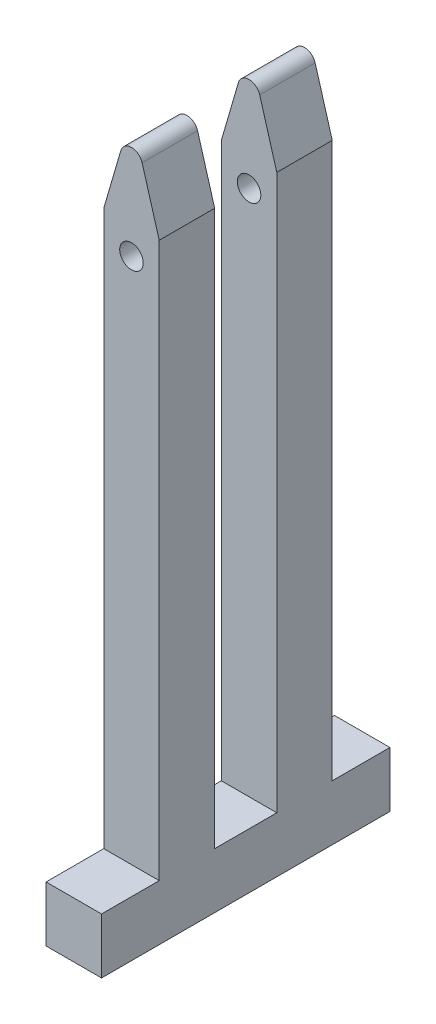
ISO-10303-21;
HEADER;
FILE_DESCRIPTION(('STEP AP214'),'2;1');
FILE_NAME('part.step','',(''),(''),'','','');
FILE_SCHEMA(('AUTOMOTIVE_DESIGN { 1 0 10303 214 1 1 1 1 }'));
ENDSEC;
DATA;
#1=APPLICATION_CONTEXT('core data for automotive mechanical design processes');
#2=APPLICATION_PROTOCOL_DEFINITION('international standard','automotive_design',2000,#1);
#3=PRODUCT_CONTEXT('',#1,'mechanical');
#4=PRODUCT('Part','Part','',(#3));
#5=PRODUCT_RELATED_PRODUCT_CATEGORY('part','',(#4));
#6=PRODUCT_DEFINITION_FORMATION('','',#4);
#7=PRODUCT_DEFINITION_CONTEXT('part definition',#1,'design');
#8=PRODUCT_DEFINITION('design','',#6,#7);
#9=PRODUCT_DEFINITION_SHAPE('','',#8);
#10=(LENGTH_UNIT() NAMED_UNIT(*) SI_UNIT(.MILLI.,.METRE.));
#11=(NAMED_UNIT(*) PLANE_ANGLE_UNIT() SI_UNIT($,.RADIAN.));
#12=(NAMED_UNIT(*) SI_UNIT($,.STERADIAN.) SOLID_ANGLE_UNIT());
#13=UNCERTAINTY_MEASURE_WITH_UNIT(LENGTH_MEASURE(1.E-05),#10,'distance_accuracy_value','');
#14=(GEOMETRIC_REPRESENTATION_CONTEXT(3) GLOBAL_UNCERTAINTY_ASSIGNED_CONTEXT((#13)) GLOBAL_UNIT_ASSIGNED_CONTEXT((#10,
#11,#12)) REPRESENTATION_CONTEXT('',''));
#15=CARTESIAN_POINT('',(0.,0.,0.));
#16=DIRECTION('',(0.,0.,1.));
#17=DIRECTION('',(1.,0.,0.));
#18=AXIS2_PLACEMENT_3D('',#15,#16,#17);
#19=CARTESIAN_POINT('',(0.,275.,-78.0512483795333));
#20=DIRECTION('',(0.,0.,1.));
#21=DIRECTION('',(1.,0.,0.));
#22=AXIS2_PLACEMENT_3D('',#19,#20,#21);
#23=CYLINDRICAL_SURFACE('',#22,5.);
#24=DIRECTION('',(0.,0.,1.));
#25=VECTOR('',#24,1.);
#26=CARTESIAN_POINT('',(4.8,276.4,-78.0512483795333));
#27=LINE('',#26,#25);
#28=CARTESIAN_POINT('',(4.80000000000001,276.4,14.));
#29=VERTEX_POINT('',#28);
#30=CARTESIAN_POINT('',(4.8,276.4,39.));
#31=VERTEX_POINT('',#30);
#32=EDGE_CURVE('E315',#29,#31,#27,.T.);
#33=ORIENTED_EDGE('',*,*,#32,.F.);
#34=CARTESIAN_POINT('',(0.,275.,14.));
#35=DIRECTION('',(0.,0.,-1.));
#36=DIRECTION('',(-1.,0.,0.));
#37=AXIS2_PLACEMENT_3D('',#34,#35,#36);
#38=CIRCLE('',#37,5.);
#39=CARTESIAN_POINT('',(-4.80000000000001,276.4,14.));
#40=VERTEX_POINT('',#39);
#41=EDGE_CURVE('E161',#29,#40,#38,.F.);
#42=ORIENTED_EDGE('',*,*,#41,.T.);
#43=DIRECTION('',(0.,0.,1.));
#44=VECTOR('',#43,1.);
#45=CARTESIAN_POINT('',(-4.8,276.4,-78.0512483795333));
#46=LINE('',#45,#44);
#47=CARTESIAN_POINT('',(-4.8,276.4,39.));
#48=VERTEX_POINT('',#47);
#49=EDGE_CURVE('E201',#40,#48,#46,.T.);
#50=ORIENTED_EDGE('',*,*,#49,.T.);
#51=CARTESIAN_POINT('',(0.,275.,39.));
#52=DIRECTION('',(0.,0.,1.));
#53=DIRECTION('',(1.,0.,0.));
#54=AXIS2_PLACEMENT_3D('',#51,#52,#53);
#55=CIRCLE('',#54,5.);
#56=EDGE_CURVE('E192',#48,#31,#55,.F.);
#57=ORIENTED_EDGE('',*,*,#56,.T.);
#58=EDGE_LOOP('',(#33,#42,#50,#57));
#59=FACE_BOUND('',#58,.T.);
#60=ADVANCED_FACE('F45',(#59),#23,.T.);
#61=DIRECTION('',(0.,0.,1.));
#62=VECTOR('',#61,1.);
#63=CARTESIAN_POINT('',(-4.8,276.4,-78.0512483795333));
#64=LINE('',#63,#62);
#65=CARTESIAN_POINT('',(-4.8,276.4,-39.));
#66=VERTEX_POINT('',#65);
#67=CARTESIAN_POINT('',(-4.8,276.4,-14.));
#68=VERTEX_POINT('',#67);
#69=EDGE_CURVE('E160',#66,#68,#64,.T.);
#70=ORIENTED_EDGE('',*,*,#69,.T.);
#71=CARTESIAN_POINT('',(0.,275.,-14.));
#72=DIRECTION('',(0.,0.,1.));
#73=DIRECTION('',(1.,0.,0.));
#74=AXIS2_PLACEMENT_3D('',#71,#72,#73);
#75=CIRCLE('',#74,5.);
#76=CARTESIAN_POINT('',(4.80000000000001,276.4,-14.));
#77=VERTEX_POINT('',#76);
#78=EDGE_CURVE('E62',#68,#77,#75,.F.);
#79=ORIENTED_EDGE('',*,*,#78,.T.);
#80=DIRECTION('',(0.,0.,1.));
#81=VECTOR('',#80,1.);
#82=CARTESIAN_POINT('',(4.8,276.4,-78.0512483795333));
#83=LINE('',#82,#81);
#84=CARTESIAN_POINT('',(4.8,276.4,-39.));
#85=VERTEX_POINT('',#84);
#86=EDGE_CURVE('E49',#85,#77,#83,.T.);
#87=ORIENTED_EDGE('',*,*,#86,.F.);
#88=CARTESIAN_POINT('',(0.,275.,-39.));
#89=DIRECTION('',(0.,0.,1.));
#90=DIRECTION('',(1.,0.,0.));
#91=AXIS2_PLACEMENT_3D('',#88,#89,#90);
#92=CIRCLE('',#91,5.);
#93=EDGE_CURVE('E189',#66,#85,#92,.F.);
#94=ORIENTED_EDGE('',*,*,#93,.F.);
#95=EDGE_LOOP('',(#70,#79,#87,#94));
#96=FACE_BOUND('',#95,.T.);
#97=ADVANCED_FACE('F155',(#96),#23,.T.);
#98=CARTESIAN_POINT('',(12.5,250.,-39.));
#99=DIRECTION('',(-1.,0.,0.));
#100=DIRECTION('',(0.,0.,1.));
#101=AXIS2_PLACEMENT_3D('',#98,#99,#100);
#102=PLANE('',#101);
#103=DIRECTION('',(0.,-1.,0.));
#104=VECTOR('',#103,1.);
#105=CARTESIAN_POINT('',(12.5,250.,-14.));
#106=LINE('',#105,#104);
#107=CARTESIAN_POINT('',(12.5,250.,-14.));
#108=VERTEX_POINT('',#107);
#109=CARTESIAN_POINT('',(12.5,0.,-14.));
#110=VERTEX_POINT('',#109);
#111=EDGE_CURVE('E167',#108,#110,#106,.T.);
#112=ORIENTED_EDGE('',*,*,#111,.T.);
#113=DIRECTION('',(0.,0.,1.));
#114=VECTOR('',#113,1.);
#115=CARTESIAN_POINT('',(12.5,0.,-65.));
#116=LINE('',#115,#114);
#117=CARTESIAN_POINT('',(12.5,0.,14.));
#118=VERTEX_POINT('',#117);
#119=EDGE_CURVE('E237',#110,#118,#116,.T.);
#120=ORIENTED_EDGE('',*,*,#119,.T.);
#121=DIRECTION('',(0.,-1.,0.));
#122=VECTOR('',#121,1.);
#123=CARTESIAN_POINT('',(12.5,250.,14.));
#124=LINE('',#123,#122);
#125=CARTESIAN_POINT('',(12.5,250.,14.));
#126=VERTEX_POINT('',#125);
#127=EDGE_CURVE('E290',#126,#118,#124,.T.);
#128=ORIENTED_EDGE('',*,*,#127,.F.);
#129=DIRECTION('',(0.,0.,-1.));
#130=VECTOR('',#129,1.);
#131=CARTESIAN_POINT('',(12.5,250.,39.));
#132=LINE('',#131,#130);
#133=CARTESIAN_POINT('',(12.5,250.,39.));
#134=VERTEX_POINT('',#133);
#135=EDGE_CURVE('E295',#134,#126,#132,.T.);
#136=ORIENTED_EDGE('',*,*,#135,.F.);
#137=DIRECTION('',(0.,-1.,0.));
#138=VECTOR('',#137,1.);
#139=CARTESIAN_POINT('',(12.5,250.,39.));
#140=LINE('',#139,#138);
#141=CARTESIAN_POINT('',(12.5,0.,39.));
#142=VERTEX_POINT('',#141);
#143=EDGE_CURVE('E288',#134,#142,#140,.T.);
#144=ORIENTED_EDGE('',*,*,#143,.T.);
#145=CARTESIAN_POINT('',(12.5,0.,65.));
#146=VERTEX_POINT('',#145);
#147=EDGE_CURVE('E247',#142,#146,#116,.T.);
#148=ORIENTED_EDGE('',*,*,#147,.T.);
#149=DIRECTION('',(0.,1.,0.));
#150=VECTOR('',#149,1.);
#151=CARTESIAN_POINT('',(12.5,-25.,65.));
#152=LINE('',#151,#150);
#153=CARTESIAN_POINT('',(12.5,-25.,65.));
#154=VERTEX_POINT('',#153);
#155=EDGE_CURVE('E275',#154,#146,#152,.T.);
#156=ORIENTED_EDGE('',*,*,#155,.F.);
#157=DIRECTION('',(0.,0.,1.));
#158=VECTOR('',#157,1.);
#159=CARTESIAN_POINT('',(12.5,-25.,-65.));
#160=LINE('',#159,#158);
#161=CARTESIAN_POINT('',(12.5,-25.,-65.));
#162=VERTEX_POINT('',#161);
#163=EDGE_CURVE('E256',#162,#154,#160,.T.);
#164=ORIENTED_EDGE('',*,*,#163,.F.);
#165=DIRECTION('',(0.,1.,0.));
#166=VECTOR('',#165,1.);
#167=CARTESIAN_POINT('',(12.5,-25.,-65.));
#168=LINE('',#167,#166);
#169=CARTESIAN_POINT('',(12.5,0.,-65.));
#170=VERTEX_POINT('',#169);
#171=EDGE_CURVE('E243',#162,#170,#168,.T.);
#172=ORIENTED_EDGE('',*,*,#171,.T.);
#173=CARTESIAN_POINT('',(12.5,0.,-39.));
#174=VERTEX_POINT('',#173);
#175=EDGE_CURVE('E240',#170,#174,#116,.T.);
#176=ORIENTED_EDGE('',*,*,#175,.T.);
#177=DIRECTION('',(0.,-1.,0.));
#178=VECTOR('',#177,1.);
#179=CARTESIAN_POINT('',(12.5,250.,-39.));
#180=LINE('',#179,#178);
#181=CARTESIAN_POINT('',(12.5,250.,-39.));
#182=VERTEX_POINT('',#181);
#183=EDGE_CURVE('E188',#182,#174,#180,.T.);
#184=ORIENTED_EDGE('',*,*,#183,.F.);
#185=DIRECTION('',(0.,0.,-1.));
#186=VECTOR('',#185,1.);
#187=CARTESIAN_POINT('',(12.5,250.,-39.));
#188=LINE('',#187,#186);
#189=EDGE_CURVE('E174',#108,#182,#188,.T.);
#190=ORIENTED_EDGE('',*,*,#189,.F.);
#191=EDGE_LOOP('',(#112,#120,#128,#136,#144,#148,#156,#164,#172,#176,#184,#190));
#192=FACE_BOUND('',#191,.T.);
#193=ADVANCED_FACE('F235',(#192),#102,.F.);
#194=CARTESIAN_POINT('',(-12.5,250.,-39.));
#195=DIRECTION('',(0.,0.,1.));
#196=DIRECTION('',(1.,0.,0.));
#197=AXIS2_PLACEMENT_3D('',#194,#195,#196);
#198=PLANE('',#197);
#199=CARTESIAN_POINT('',(0.,237.5,-39.));
#200=DIRECTION('',(0.,0.,1.));
#201=DIRECTION('',(1.,0.,0.));
#202=AXIS2_PLACEMENT_3D('',#199,#200,#201);
#203=CIRCLE('',#202,5.3);
#204=CARTESIAN_POINT('',(5.29999999999999,237.5,-39.));
#205=VERTEX_POINT('',#204);
#206=EDGE_CURVE('E183',#205,#205,#203,.T.);
#207=ORIENTED_EDGE('',*,*,#206,.T.);
#208=EDGE_LOOP('',(#207));
#209=FACE_BOUND('',#208,.T.);
#210=DIRECTION('',(0.28,0.96,0.));
#211=VECTOR('',#210,1.);
#212=CARTESIAN_POINT('',(-12.5,250.,-39.));
#213=LINE('',#212,#211);
#214=CARTESIAN_POINT('',(-12.5,250.,-39.));
#215=VERTEX_POINT('',#214);
#216=EDGE_CURVE('E190',#215,#66,#213,.T.);
#217=ORIENTED_EDGE('',*,*,#216,.T.);
#218=ORIENTED_EDGE('',*,*,#93,.T.);
#219=DIRECTION('',(0.279999999999999,-0.96,0.));
#220=VECTOR('',#219,1.);
#221=CARTESIAN_POINT('',(4.8,276.4,-39.));
#222=LINE('',#221,#220);
#223=EDGE_CURVE('E173',#85,#182,#222,.T.);
#224=ORIENTED_EDGE('',*,*,#223,.T.);
#225=ORIENTED_EDGE('',*,*,#183,.T.);
#226=DIRECTION('',(-1.,0.,0.));
#227=VECTOR('',#226,1.);
#228=CARTESIAN_POINT('',(-12.5,0.,-39.));
#229=LINE('',#228,#227);
#230=CARTESIAN_POINT('',(-12.5,0.,-39.));
#231=VERTEX_POINT('',#230);
#232=EDGE_CURVE('E186',#174,#231,#229,.T.);
#233=ORIENTED_EDGE('',*,*,#232,.T.);
#234=DIRECTION('',(0.,-1.,0.));
#235=VECTOR('',#234,1.);
#236=CARTESIAN_POINT('',(-12.5,250.,-39.));
#237=LINE('',#236,#235);
#238=EDGE_CURVE('E209',#215,#231,#237,.T.);
#239=ORIENTED_EDGE('',*,*,#238,.F.);
#240=EDGE_LOOP('',(#217,#218,#224,#225,#233,#239));
#241=FACE_BOUND('',#240,.T.);
#242=ADVANCED_FACE('F218',(#209,#241),#198,.F.);
#243=CARTESIAN_POINT('',(-12.5,250.,-39.));
#244=DIRECTION('',(1.,0.,0.));
#245=DIRECTION('',(0.,0.,-1.));
#246=AXIS2_PLACEMENT_3D('',#243,#244,#245);
#247=PLANE('',#246);
#248=ORIENTED_EDGE('',*,*,#238,.T.);
#249=DIRECTION('',(0.,0.,-1.));
#250=VECTOR('',#249,1.);
#251=CARTESIAN_POINT('',(-12.5,0.,-65.));
#252=LINE('',#251,#250);
#253=CARTESIAN_POINT('',(-12.5,0.,-65.));
#254=VERTEX_POINT('',#253);
#255=EDGE_CURVE('E226',#231,#254,#252,.T.);
#256=ORIENTED_EDGE('',*,*,#255,.T.);
#257=DIRECTION('',(0.,1.,0.));
#258=VECTOR('',#257,1.);
#259=CARTESIAN_POINT('',(-12.5,-25.,-65.));
#260=LINE('',#259,#258);
#261=CARTESIAN_POINT('',(-12.5,-25.,-65.));
#262=VERTEX_POINT('',#261);
#263=EDGE_CURVE('E266',#262,#254,#260,.T.);
#264=ORIENTED_EDGE('',*,*,#263,.F.);
#265=DIRECTION('',(0.,0.,-1.));
#266=VECTOR('',#265,1.);
#267=CARTESIAN_POINT('',(-12.5,-25.,-65.));
#268=LINE('',#267,#266);
#269=CARTESIAN_POINT('',(-12.5,-25.,65.));
#270=VERTEX_POINT('',#269);
#271=EDGE_CURVE('E262',#270,#262,#268,.T.);
#272=ORIENTED_EDGE('',*,*,#271,.F.);
#273=DIRECTION('',(0.,1.,0.));
#274=VECTOR('',#273,1.);
#275=CARTESIAN_POINT('',(-12.5,-25.,65.));
#276=LINE('',#275,#274);
#277=CARTESIAN_POINT('',(-12.5,0.,65.));
#278=VERTEX_POINT('',#277);
#279=EDGE_CURVE('E268',#270,#278,#276,.T.);
#280=ORIENTED_EDGE('',*,*,#279,.T.);
#281=CARTESIAN_POINT('',(-12.5,0.,39.));
#282=VERTEX_POINT('',#281);
#283=EDGE_CURVE('E385',#278,#282,#252,.T.);
#284=ORIENTED_EDGE('',*,*,#283,.T.);
#285=DIRECTION('',(0.,-1.,0.));
#286=VECTOR('',#285,1.);
#287=CARTESIAN_POINT('',(-12.5,250.,39.));
#288=LINE('',#287,#286);
#289=CARTESIAN_POINT('',(-12.5,250.,39.));
#290=VERTEX_POINT('',#289);
#291=EDGE_CURVE('E285',#290,#282,#288,.T.);
#292=ORIENTED_EDGE('',*,*,#291,.F.);
#293=DIRECTION('',(0.,0.,1.));
#294=VECTOR('',#293,1.);
#295=CARTESIAN_POINT('',(-12.5,250.,39.));
#296=LINE('',#295,#294);
#297=CARTESIAN_POINT('',(-12.5,250.,14.));
#298=VERTEX_POINT('',#297);
#299=EDGE_CURVE('E300',#298,#290,#296,.T.);
#300=ORIENTED_EDGE('',*,*,#299,.F.);
#301=DIRECTION('',(0.,-1.,0.));
#302=VECTOR('',#301,1.);
#303=CARTESIAN_POINT('',(-12.5,250.,14.));
#304=LINE('',#303,#302);
#305=CARTESIAN_POINT('',(-12.5,0.,14.));
#306=VERTEX_POINT('',#305);
#307=EDGE_CURVE('E292',#298,#306,#304,.T.);
#308=ORIENTED_EDGE('',*,*,#307,.T.);
#309=CARTESIAN_POINT('',(-12.5,0.,-14.));
#310=VERTEX_POINT('',#309);
#311=EDGE_CURVE('E386',#306,#310,#252,.T.);
#312=ORIENTED_EDGE('',*,*,#311,.T.);
#313=DIRECTION('',(0.,-1.,0.));
#314=VECTOR('',#313,1.);
#315=CARTESIAN_POINT('',(-12.5,250.,-14.));
#316=LINE('',#315,#314);
#317=CARTESIAN_POINT('',(-12.5,250.,-14.));
#318=VERTEX_POINT('',#317);
#319=EDGE_CURVE('E179',#318,#310,#316,.T.);
#320=ORIENTED_EDGE('',*,*,#319,.F.);
#321=DIRECTION('',(0.,0.,1.));
#322=VECTOR('',#321,1.);
#323=CARTESIAN_POINT('',(-12.5,250.,-39.));
#324=LINE('',#323,#322);
#325=EDGE_CURVE('E176',#215,#318,#324,.T.);
#326=ORIENTED_EDGE('',*,*,#325,.F.);
#327=EDGE_LOOP('',(#248,#256,#264,#272,#280,#284,#292,#300,#308,#312,#320,#326));
#328=FACE_BOUND('',#327,.T.);
#329=ADVANCED_FACE('F224',(#328),#247,.F.);
#330=CARTESIAN_POINT('',(-12.5,250.,-14.));
#331=DIRECTION('',(0.,0.,-1.));
#332=DIRECTION('',(-1.,0.,0.));
#333=AXIS2_PLACEMENT_3D('',#330,#331,#332);
#334=PLANE('',#333);
#335=CARTESIAN_POINT('',(0.,237.5,-14.));
#336=DIRECTION('',(0.,0.,-1.));
#337=DIRECTION('',(-1.,0.,0.));
#338=AXIS2_PLACEMENT_3D('',#335,#336,#337);
#339=CIRCLE('',#338,5.3);
#340=CARTESIAN_POINT('',(-5.30000000000001,237.5,-14.));
#341=VERTEX_POINT('',#340);
#342=EDGE_CURVE('E205',#341,#341,#339,.T.);
#343=ORIENTED_EDGE('',*,*,#342,.T.);
#344=EDGE_LOOP('',(#343));
#345=FACE_BOUND('',#344,.T.);
#346=DIRECTION('',(-0.279999999999999,0.96,0.));
#347=VECTOR('',#346,1.);
#348=CARTESIAN_POINT('',(4.8,276.4,-14.));
#349=LINE('',#348,#347);
#350=EDGE_CURVE('E11',#108,#77,#349,.T.);
#351=ORIENTED_EDGE('',*,*,#350,.T.);
#352=ORIENTED_EDGE('',*,*,#78,.F.);
#353=DIRECTION('',(-0.28,-0.96,0.));
#354=VECTOR('',#353,1.);
#355=CARTESIAN_POINT('',(-12.5,250.,-14.));
#356=LINE('',#355,#354);
#357=EDGE_CURVE('E55',#68,#318,#356,.T.);
#358=ORIENTED_EDGE('',*,*,#357,.T.);
#359=ORIENTED_EDGE('',*,*,#319,.T.);
#360=DIRECTION('',(1.,0.,0.));
#361=VECTOR('',#360,1.);
#362=CARTESIAN_POINT('',(-12.5,0.,-14.));
#363=LINE('',#362,#361);
#364=EDGE_CURVE('E208',#310,#110,#363,.T.);
#365=ORIENTED_EDGE('',*,*,#364,.T.);
#366=ORIENTED_EDGE('',*,*,#111,.F.);
#367=EDGE_LOOP('',(#351,#352,#358,#359,#365,#366));
#368=FACE_BOUND('',#367,.T.);
#369=ADVANCED_FACE('F164',(#345,#368),#334,.F.);
#370=CARTESIAN_POINT('',(0.,237.5,-39.));
#371=DIRECTION('',(0.,0.,1.));
#372=DIRECTION('',(1.,0.,0.));
#373=AXIS2_PLACEMENT_3D('',#370,#371,#372);
#374=CYLINDRICAL_SURFACE('',#373,5.3);
#375=ORIENTED_EDGE('',*,*,#206,.F.);
#376=EDGE_LOOP('',(#375));
#377=FACE_BOUND('',#376,.T.);
#378=ORIENTED_EDGE('',*,*,#342,.F.);
#379=EDGE_LOOP('',(#378));
#380=FACE_BOUND('',#379,.T.);
#381=ADVANCED_FACE('F339',(#377,#380),#374,.F.);
#382=CARTESIAN_POINT('',(-12.5,250.,-78.0512483795333));
#383=DIRECTION('',(-0.96,0.28,0.));
#384=DIRECTION('',(-0.28,-0.96,0.));
#385=AXIS2_PLACEMENT_3D('',#382,#383,#384);
#386=PLANE('',#385);
#387=ORIENTED_EDGE('',*,*,#357,.F.);
#388=ORIENTED_EDGE('',*,*,#69,.F.);
#389=ORIENTED_EDGE('',*,*,#216,.F.);
#390=ORIENTED_EDGE('',*,*,#325,.T.);
#391=EDGE_LOOP('',(#387,#388,#389,#390));
#392=FACE_BOUND('',#391,.T.);
#393=ADVANCED_FACE('F47',(#392),#386,.T.);
#394=CARTESIAN_POINT('',(4.8,276.4,-78.0512483795333));
#395=DIRECTION('',(0.96,0.279999999999999,0.));
#396=DIRECTION('',(-0.279999999999999,0.96,0.));
#397=AXIS2_PLACEMENT_3D('',#394,#395,#396);
#398=PLANE('',#397);
#399=ORIENTED_EDGE('',*,*,#350,.F.);
#400=ORIENTED_EDGE('',*,*,#189,.T.);
#401=ORIENTED_EDGE('',*,*,#223,.F.);
#402=ORIENTED_EDGE('',*,*,#86,.T.);
#403=EDGE_LOOP('',(#399,#400,#401,#402));
#404=FACE_BOUND('',#403,.T.);
#405=ADVANCED_FACE('F171',(#404),#398,.T.);
#406=CARTESIAN_POINT('',(0.,275.,39.));
#407=DIRECTION('',(0.,0.,1.));
#408=DIRECTION('',(1.,0.,0.));
#409=AXIS2_PLACEMENT_3D('',#406,#407,#408);
#410=PLANE('',#409);
#411=ORIENTED_EDGE('',*,*,#56,.F.);
#412=DIRECTION('',(-0.28,-0.96,0.));
#413=VECTOR('',#412,1.);
#414=CARTESIAN_POINT('',(-12.5,250.,39.));
#415=LINE('',#414,#413);
#416=EDGE_CURVE('E312',#48,#290,#415,.T.);
#417=ORIENTED_EDGE('',*,*,#416,.T.);
#418=ORIENTED_EDGE('',*,*,#291,.T.);
#419=DIRECTION('',(1.,0.,0.));
#420=VECTOR('',#419,1.);
#421=CARTESIAN_POINT('',(-12.5,0.,39.));
#422=LINE('',#421,#420);
#423=EDGE_CURVE('E299',#282,#142,#422,.T.);
#424=ORIENTED_EDGE('',*,*,#423,.T.);
#425=ORIENTED_EDGE('',*,*,#143,.F.);
#426=DIRECTION('',(-0.279999999999999,0.96,0.));
#427=VECTOR('',#426,1.);
#428=CARTESIAN_POINT('',(4.8,276.4,39.));
#429=LINE('',#428,#427);
#430=EDGE_CURVE('E303',#134,#31,#429,.T.);
#431=ORIENTED_EDGE('',*,*,#430,.T.);
#432=EDGE_LOOP('',(#411,#417,#418,#424,#425,#431));
#433=FACE_BOUND('',#432,.T.);
#434=CARTESIAN_POINT('',(0.,237.5,39.));
#435=DIRECTION('',(0.,0.,1.));
#436=DIRECTION('',(1.,0.,0.));
#437=AXIS2_PLACEMENT_3D('',#434,#435,#436);
#438=CIRCLE('',#437,5.3);
#439=CARTESIAN_POINT('',(5.29999999999999,237.5,39.));
#440=VERTEX_POINT('',#439);
#441=EDGE_CURVE('E281',#440,#440,#438,.T.);
#442=ORIENTED_EDGE('',*,*,#441,.F.);
#443=EDGE_LOOP('',(#442));
#444=FACE_BOUND('',#443,.T.);
#445=ADVANCED_FACE('F322',(#433,#444),#410,.T.);
#446=CARTESIAN_POINT('',(4.8,276.4,-78.0512483795333));
#447=DIRECTION('',(0.96,0.279999999999999,0.));
#448=DIRECTION('',(-0.279999999999999,0.96,0.));
#449=AXIS2_PLACEMENT_3D('',#446,#447,#448);
#450=PLANE('',#449);
#451=DIRECTION('',(0.279999999999999,-0.96,0.));
#452=VECTOR('',#451,1.);
#453=CARTESIAN_POINT('',(4.8,276.4,14.));
#454=LINE('',#453,#452);
#455=EDGE_CURVE('E195',#29,#126,#454,.T.);
#456=ORIENTED_EDGE('',*,*,#455,.F.);
#457=ORIENTED_EDGE('',*,*,#32,.T.);
#458=ORIENTED_EDGE('',*,*,#430,.F.);
#459=ORIENTED_EDGE('',*,*,#135,.T.);
#460=EDGE_LOOP('',(#456,#457,#458,#459));
#461=FACE_BOUND('',#460,.T.);
#462=ADVANCED_FACE('F319',(#461),#450,.T.);
#463=CARTESIAN_POINT('',(-12.5,250.,-78.0512483795333));
#464=DIRECTION('',(-0.96,0.28,0.));
#465=DIRECTION('',(-0.28,-0.96,0.));
#466=AXIS2_PLACEMENT_3D('',#463,#464,#465);
#467=PLANE('',#466);
#468=DIRECTION('',(0.28,0.96,0.));
#469=VECTOR('',#468,1.);
#470=CARTESIAN_POINT('',(-12.5,250.,14.));
#471=LINE('',#470,#469);
#472=EDGE_CURVE('E278',#298,#40,#471,.T.);
#473=ORIENTED_EDGE('',*,*,#472,.F.);
#474=ORIENTED_EDGE('',*,*,#299,.T.);
#475=ORIENTED_EDGE('',*,*,#416,.F.);
#476=ORIENTED_EDGE('',*,*,#49,.F.);
#477=EDGE_LOOP('',(#473,#474,#475,#476));
#478=FACE_BOUND('',#477,.T.);
#479=ADVANCED_FACE('F330',(#478),#467,.T.);
#480=CARTESIAN_POINT('',(0.,237.5,-39.));
#481=DIRECTION('',(0.,0.,1.));
#482=DIRECTION('',(1.,0.,0.));
#483=AXIS2_PLACEMENT_3D('',#480,#481,#482);
#484=CYLINDRICAL_SURFACE('',#483,5.3);
#485=ORIENTED_EDGE('',*,*,#441,.T.);
#486=EDGE_LOOP('',(#485));
#487=FACE_BOUND('',#486,.T.);
#488=CARTESIAN_POINT('',(0.,237.5,14.));
#489=DIRECTION('',(0.,0.,1.));
#490=DIRECTION('',(1.,0.,0.));
#491=AXIS2_PLACEMENT_3D('',#488,#489,#490);
#492=CIRCLE('',#491,5.3);
#493=CARTESIAN_POINT('',(5.29999999999999,237.5,14.));
#494=VERTEX_POINT('',#493);
#495=EDGE_CURVE('E284',#494,#494,#492,.T.);
#496=ORIENTED_EDGE('',*,*,#495,.F.);
#497=EDGE_LOOP('',(#496));
#498=FACE_BOUND('',#497,.T.);
#499=ADVANCED_FACE('F359',(#487,#498),#484,.F.);
#500=CARTESIAN_POINT('',(-12.5,250.,14.));
#501=DIRECTION('',(0.,0.,1.));
#502=DIRECTION('',(1.,0.,0.));
#503=AXIS2_PLACEMENT_3D('',#500,#501,#502);
#504=PLANE('',#503);
#505=ORIENTED_EDGE('',*,*,#472,.T.);
#506=ORIENTED_EDGE('',*,*,#41,.F.);
#507=ORIENTED_EDGE('',*,*,#455,.T.);
#508=ORIENTED_EDGE('',*,*,#127,.T.);
#509=DIRECTION('',(-1.,0.,0.));
#510=VECTOR('',#509,1.);
#511=CARTESIAN_POINT('',(-12.5,0.,14.));
#512=LINE('',#511,#510);
#513=EDGE_CURVE('E296',#118,#306,#512,.T.);
#514=ORIENTED_EDGE('',*,*,#513,.T.);
#515=ORIENTED_EDGE('',*,*,#307,.F.);
#516=EDGE_LOOP('',(#505,#506,#507,#508,#514,#515));
#517=FACE_BOUND('',#516,.T.);
#518=ORIENTED_EDGE('',*,*,#495,.T.);
#519=EDGE_LOOP('',(#518));
#520=FACE_BOUND('',#519,.T.);
#521=ADVANCED_FACE('F325',(#517,#520),#504,.F.);
#522=CARTESIAN_POINT('',(0.,0.,0.));
#523=DIRECTION('',(0.,1.,0.));
#524=DIRECTION('',(0.,0.,1.));
#525=AXIS2_PLACEMENT_3D('',#522,#523,#524);
#526=PLANE('',#525);
#527=ORIENTED_EDGE('',*,*,#364,.F.);
#528=ORIENTED_EDGE('',*,*,#311,.F.);
#529=ORIENTED_EDGE('',*,*,#513,.F.);
#530=ORIENTED_EDGE('',*,*,#119,.F.);
#531=EDGE_LOOP('',(#527,#528,#529,#530));
#532=FACE_BOUND('',#531,.T.);
#533=ADVANCED_FACE('F362',(#532),#526,.T.);
#534=ORIENTED_EDGE('',*,*,#232,.F.);
#535=ORIENTED_EDGE('',*,*,#175,.F.);
#536=DIRECTION('',(1.,0.,0.));
#537=VECTOR('',#536,1.);
#538=CARTESIAN_POINT('',(-12.5,0.,-65.));
#539=LINE('',#538,#537);
#540=EDGE_CURVE('E260',#254,#170,#539,.T.);
#541=ORIENTED_EDGE('',*,*,#540,.F.);
#542=ORIENTED_EDGE('',*,*,#255,.F.);
#543=EDGE_LOOP('',(#534,#535,#541,#542));
#544=FACE_BOUND('',#543,.T.);
#545=ADVANCED_FACE('F378',(#544),#526,.T.);
#546=ORIENTED_EDGE('',*,*,#423,.F.);
#547=ORIENTED_EDGE('',*,*,#283,.F.);
#548=DIRECTION('',(-1.,0.,0.));
#549=VECTOR('',#548,1.);
#550=CARTESIAN_POINT('',(-12.5,0.,65.));
#551=LINE('',#550,#549);
#552=EDGE_CURVE('E245',#146,#278,#551,.T.);
#553=ORIENTED_EDGE('',*,*,#552,.F.);
#554=ORIENTED_EDGE('',*,*,#147,.F.);
#555=EDGE_LOOP('',(#546,#547,#553,#554));
#556=FACE_BOUND('',#555,.T.);
#557=ADVANCED_FACE('F370',(#556),#526,.T.);
#558=CARTESIAN_POINT('',(-12.5,-25.,65.));
#559=DIRECTION('',(0.,0.,-1.));
#560=DIRECTION('',(-1.,0.,0.));
#561=AXIS2_PLACEMENT_3D('',#558,#559,#560);
#562=PLANE('',#561);
#563=ORIENTED_EDGE('',*,*,#552,.T.);
#564=ORIENTED_EDGE('',*,*,#279,.F.);
#565=DIRECTION('',(-1.,0.,0.));
#566=VECTOR('',#565,1.);
#567=CARTESIAN_POINT('',(-12.5,-25.,65.));
#568=LINE('',#567,#566);
#569=EDGE_CURVE('E259',#154,#270,#568,.T.);
#570=ORIENTED_EDGE('',*,*,#569,.F.);
#571=ORIENTED_EDGE('',*,*,#155,.T.);
#572=EDGE_LOOP('',(#563,#564,#570,#571));
#573=FACE_BOUND('',#572,.T.);
#574=ADVANCED_FACE('F366',(#573),#562,.F.);
#575=CARTESIAN_POINT('',(-12.5,-25.,-65.));
#576=DIRECTION('',(0.,0.,1.));
#577=DIRECTION('',(1.,0.,0.));
#578=AXIS2_PLACEMENT_3D('',#575,#576,#577);
#579=PLANE('',#578);
#580=ORIENTED_EDGE('',*,*,#540,.T.);
#581=ORIENTED_EDGE('',*,*,#171,.F.);
#582=DIRECTION('',(1.,0.,0.));
#583=VECTOR('',#582,1.);
#584=CARTESIAN_POINT('',(-12.5,-25.,-65.));
#585=LINE('',#584,#583);
#586=EDGE_CURVE('E263',#262,#162,#585,.T.);
#587=ORIENTED_EDGE('',*,*,#586,.F.);
#588=ORIENTED_EDGE('',*,*,#263,.T.);
#589=EDGE_LOOP('',(#580,#581,#587,#588));
#590=FACE_BOUND('',#589,.T.);
#591=ADVANCED_FACE('F369',(#590),#579,.F.);
#592=CARTESIAN_POINT('',(0.,-25.,0.));
#593=DIRECTION('',(0.,1.,0.));
#594=DIRECTION('',(0.,0.,1.));
#595=AXIS2_PLACEMENT_3D('',#592,#593,#594);
#596=PLANE('',#595);
#597=ORIENTED_EDGE('',*,*,#163,.T.);
#598=ORIENTED_EDGE('',*,*,#569,.T.);
#599=ORIENTED_EDGE('',*,*,#271,.T.);
#600=ORIENTED_EDGE('',*,*,#586,.T.);
#601=EDGE_LOOP('',(#597,#598,#599,#600));
#602=FACE_BOUND('',#601,.T.);
#603=ADVANCED_FACE('F374',(#602),#596,.F.);
#604=CLOSED_SHELL('',(#60,#97,#193,#242,#329,#369,#381,#393,#405,#445,#462,#479,#499,#521,#533,
#545,#557,#574,#591,#603));
#605=MANIFOLD_SOLID_BREP('B2',#604);
#606=ADVANCED_BREP_SHAPE_REPRESENTATION('',(#18,#605),#14);
#607=SHAPE_DEFINITION_REPRESENTATION(#9,#606);
ENDSEC;
END-ISO-10303-21;
